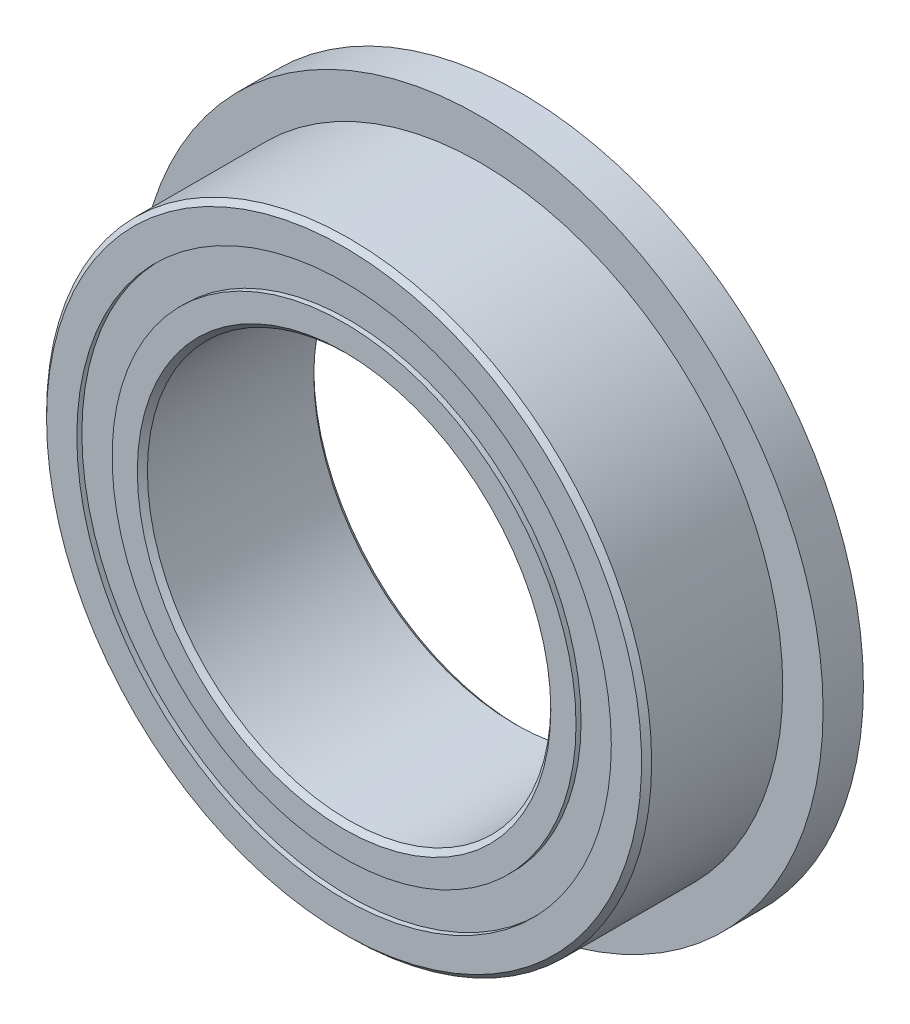
ISO-10303-21;
HEADER;
FILE_DESCRIPTION(('STEP AP214'),'2;1');
FILE_NAME('part.step','',(''),(''),'','','');
FILE_SCHEMA(('AUTOMOTIVE_DESIGN { 1 0 10303 214 1 1 1 1 }'));
ENDSEC;
DATA;
#1=APPLICATION_CONTEXT('core data for automotive mechanical design processes');
#2=APPLICATION_PROTOCOL_DEFINITION('international standard','automotive_design',2000,#1);
#3=PRODUCT_CONTEXT('',#1,'mechanical');
#4=PRODUCT('Part','Part','',(#3));
#5=PRODUCT_RELATED_PRODUCT_CATEGORY('part','',(#4));
#6=PRODUCT_DEFINITION_FORMATION('','',#4);
#7=PRODUCT_DEFINITION_CONTEXT('part definition',#1,'design');
#8=PRODUCT_DEFINITION('design','',#6,#7);
#9=PRODUCT_DEFINITION_SHAPE('','',#8);
#10=(LENGTH_UNIT() NAMED_UNIT(*) SI_UNIT(.MILLI.,.METRE.));
#11=(NAMED_UNIT(*) PLANE_ANGLE_UNIT() SI_UNIT($,.RADIAN.));
#12=(NAMED_UNIT(*) SI_UNIT($,.STERADIAN.) SOLID_ANGLE_UNIT());
#13=UNCERTAINTY_MEASURE_WITH_UNIT(LENGTH_MEASURE(1.E-05),#10,'distance_accuracy_value','');
#14=(GEOMETRIC_REPRESENTATION_CONTEXT(3) GLOBAL_UNCERTAINTY_ASSIGNED_CONTEXT((#13)) GLOBAL_UNIT_ASSIGNED_CONTEXT((#10,
#11,#12)) REPRESENTATION_CONTEXT('',''));
#15=CARTESIAN_POINT('',(0.,0.,0.));
#16=DIRECTION('',(0.,0.,1.));
#17=DIRECTION('',(1.,0.,0.));
#18=AXIS2_PLACEMENT_3D('',#15,#16,#17);
#19=CARTESIAN_POINT('',(0.,6.,1.75));
#20=DIRECTION('',(0.,0.,-1.));
#21=DIRECTION('',(-1.,0.,0.));
#22=AXIS2_PLACEMENT_3D('',#19,#20,#21);
#23=PLANE('',#22);
#24=CARTESIAN_POINT('',(0.,0.,1.75));
#25=DIRECTION('',(0.,0.,1.));
#26=DIRECTION('',(1.,0.,0.));
#27=AXIS2_PLACEMENT_3D('',#24,#25,#26);
#28=CIRCLE('',#27,4.6);
#29=CARTESIAN_POINT('',(4.6,0.,1.75));
#30=VERTEX_POINT('',#29);
#31=EDGE_CURVE('E18',#30,#30,#28,.F.);
#32=ORIENTED_EDGE('',*,*,#31,.F.);
#33=EDGE_LOOP('',(#32));
#34=FACE_BOUND('',#33,.T.);
#35=CARTESIAN_POINT('',(0.,0.,1.74999999995862));
#36=DIRECTION('',(0.,0.,1.));
#37=DIRECTION('',(0.,-1.,0.));
#38=AXIS2_PLACEMENT_3D('',#35,#36,#37);
#39=CIRCLE('',#38,4.099999999994);
#40=CARTESIAN_POINT('',(0.,-4.099999999994,1.74999999995862));
#41=VERTEX_POINT('',#40);
#42=EDGE_CURVE('E63',#41,#41,#39,.F.);
#43=ORIENTED_EDGE('',*,*,#42,.T.);
#44=EDGE_LOOP('',(#43));
#45=FACE_BOUND('',#44,.T.);
#46=ADVANCED_FACE('F15',(#34,#45),#23,.F.);
#47=CARTESIAN_POINT('',(0.,0.,1.65));
#48=DIRECTION('',(0.,0.,1.));
#49=DIRECTION('',(1.,0.,0.));
#50=AXIS2_PLACEMENT_3D('',#47,#48,#49);
#51=CYLINDRICAL_SURFACE('',#50,4.6);
#52=CARTESIAN_POINT('',(0.,0.,1.65));
#53=DIRECTION('',(0.,0.,1.));
#54=DIRECTION('',(1.,0.,0.));
#55=AXIS2_PLACEMENT_3D('',#52,#53,#54);
#56=CIRCLE('',#55,4.6);
#57=CARTESIAN_POINT('',(4.6,0.,1.65));
#58=VERTEX_POINT('',#57);
#59=EDGE_CURVE('E61',#58,#58,#56,.F.);
#60=ORIENTED_EDGE('',*,*,#59,.F.);
#61=EDGE_LOOP('',(#60));
#62=FACE_BOUND('',#61,.T.);
#63=ORIENTED_EDGE('',*,*,#31,.T.);
#64=EDGE_LOOP('',(#63));
#65=FACE_BOUND('',#64,.T.);
#66=ADVANCED_FACE('F70',(#62,#65),#51,.T.);
#67=CARTESIAN_POINT('',(0.,0.,1.74999999990177));
#68=DIRECTION('',(0.,0.,1.));
#69=DIRECTION('',(0.,-1.,0.));
#70=AXIS2_PLACEMENT_3D('',#67,#68,#69);
#71=CONICAL_SURFACE('',#70,4.09999999993715,0.785398163397448);
#72=ORIENTED_EDGE('',*,*,#42,.F.);
#73=EDGE_LOOP('',(#72));
#74=FACE_BOUND('',#73,.T.);
#75=CARTESIAN_POINT('',(0.,0.,1.65));
#76=DIRECTION('',(0.,0.,1.));
#77=DIRECTION('',(1.,0.,0.));
#78=AXIS2_PLACEMENT_3D('',#75,#76,#77);
#79=CIRCLE('',#78,4.);
#80=CARTESIAN_POINT('',(4.,0.,1.65));
#81=VERTEX_POINT('',#80);
#82=EDGE_CURVE('E30',#81,#81,#79,.F.);
#83=ORIENTED_EDGE('',*,*,#82,.T.);
#84=EDGE_LOOP('',(#83));
#85=FACE_BOUND('',#84,.T.);
#86=ADVANCED_FACE('F76',(#74,#85),#71,.F.);
#87=CARTESIAN_POINT('',(0.,0.,1.65));
#88=DIRECTION('',(0.,0.,1.));
#89=DIRECTION('',(1.,0.,0.));
#90=AXIS2_PLACEMENT_3D('',#87,#88,#89);
#91=PLANE('',#90);
#92=CARTESIAN_POINT('',(0.,0.,1.65));
#93=DIRECTION('',(0.,0.,1.));
#94=DIRECTION('',(1.,0.,0.));
#95=AXIS2_PLACEMENT_3D('',#92,#93,#94);
#96=CIRCLE('',#95,5.3);
#97=CARTESIAN_POINT('',(5.3,0.,1.65));
#98=VERTEX_POINT('',#97);
#99=EDGE_CURVE('E58',#98,#98,#96,.T.);
#100=ORIENTED_EDGE('',*,*,#99,.T.);
#101=EDGE_LOOP('',(#100));
#102=FACE_BOUND('',#101,.T.);
#103=ORIENTED_EDGE('',*,*,#59,.T.);
#104=EDGE_LOOP('',(#103));
#105=FACE_BOUND('',#104,.T.);
#106=ADVANCED_FACE('F133',(#102,#105),#91,.T.);
#107=CARTESIAN_POINT('',(0.,0.,1.75));
#108=DIRECTION('',(0.,0.,1.));
#109=DIRECTION('',(1.,0.,0.));
#110=AXIS2_PLACEMENT_3D('',#107,#108,#109);
#111=CYLINDRICAL_SURFACE('',#110,4.);
#112=ORIENTED_EDGE('',*,*,#82,.F.);
#113=EDGE_LOOP('',(#112));
#114=FACE_BOUND('',#113,.T.);
#115=CARTESIAN_POINT('',(0.,0.,-1.64999999998372));
#116=DIRECTION('',(0.,0.,-1.));
#117=DIRECTION('',(-1.,0.,0.));
#118=AXIS2_PLACEMENT_3D('',#115,#116,#117);
#119=CIRCLE('',#118,3.99999999996226);
#120=CARTESIAN_POINT('',(-3.99999999996226,0.,-1.64999999998372));
#121=VERTEX_POINT('',#120);
#122=EDGE_CURVE('E57',#121,#121,#119,.T.);
#123=ORIENTED_EDGE('',*,*,#122,.T.);
#124=EDGE_LOOP('',(#123));
#125=FACE_BOUND('',#124,.T.);
#126=ADVANCED_FACE('F129',(#114,#125),#111,.F.);
#127=CARTESIAN_POINT('',(0.,0.,1.65));
#128=DIRECTION('',(0.,0.,1.));
#129=DIRECTION('',(1.,0.,0.));
#130=AXIS2_PLACEMENT_3D('',#127,#128,#129);
#131=CYLINDRICAL_SURFACE('',#130,5.3);
#132=ORIENTED_EDGE('',*,*,#99,.F.);
#133=EDGE_LOOP('',(#132));
#134=FACE_BOUND('',#133,.T.);
#135=CARTESIAN_POINT('',(0.,0.,1.75));
#136=DIRECTION('',(0.,0.,1.));
#137=DIRECTION('',(1.,0.,0.));
#138=AXIS2_PLACEMENT_3D('',#135,#136,#137);
#139=CIRCLE('',#138,5.3);
#140=CARTESIAN_POINT('',(5.3,0.,1.75));
#141=VERTEX_POINT('',#140);
#142=EDGE_CURVE('E54',#141,#141,#139,.T.);
#143=ORIENTED_EDGE('',*,*,#142,.T.);
#144=EDGE_LOOP('',(#143));
#145=FACE_BOUND('',#144,.T.);
#146=ADVANCED_FACE('F125',(#134,#145),#131,.F.);
#147=CARTESIAN_POINT('',(0.,0.,-1.74999999995862));
#148=DIRECTION('',(0.,0.,-1.));
#149=DIRECTION('',(-1.,0.,0.));
#150=AXIS2_PLACEMENT_3D('',#147,#148,#149);
#151=CONICAL_SURFACE('',#150,4.09999999993715,0.785398163397448);
#152=CARTESIAN_POINT('',(0.,0.,-1.75000000001546));
#153=DIRECTION('',(0.,0.,-1.));
#154=DIRECTION('',(-1.,0.,0.));
#155=AXIS2_PLACEMENT_3D('',#152,#153,#154);
#156=CIRCLE('',#155,4.099999999994);
#157=CARTESIAN_POINT('',(-4.099999999994,0.,-1.75000000001546));
#158=VERTEX_POINT('',#157);
#159=EDGE_CURVE('E51',#158,#158,#156,.T.);
#160=ORIENTED_EDGE('',*,*,#159,.T.);
#161=EDGE_LOOP('',(#160));
#162=FACE_BOUND('',#161,.T.);
#163=ORIENTED_EDGE('',*,*,#122,.F.);
#164=EDGE_LOOP('',(#163));
#165=FACE_BOUND('',#164,.T.);
#166=ADVANCED_FACE('F121',(#162,#165),#151,.F.);
#167=CARTESIAN_POINT('',(0.,6.,1.75));
#168=DIRECTION('',(0.,0.,-1.));
#169=DIRECTION('',(-1.,0.,0.));
#170=AXIS2_PLACEMENT_3D('',#167,#168,#169);
#171=PLANE('',#170);
#172=ORIENTED_EDGE('',*,*,#142,.F.);
#173=EDGE_LOOP('',(#172));
#174=FACE_BOUND('',#173,.T.);
#175=CARTESIAN_POINT('',(0.,0.,1.74999999995862));
#176=DIRECTION('',(0.,0.,-1.));
#177=DIRECTION('',(-1.,0.,0.));
#178=AXIS2_PLACEMENT_3D('',#175,#176,#177);
#179=CIRCLE('',#178,5.89999999999691);
#180=CARTESIAN_POINT('',(-5.89999999999691,0.,1.74999999995862));
#181=VERTEX_POINT('',#180);
#182=EDGE_CURVE('E48',#181,#181,#179,.T.);
#183=ORIENTED_EDGE('',*,*,#182,.F.);
#184=EDGE_LOOP('',(#183));
#185=FACE_BOUND('',#184,.T.);
#186=ADVANCED_FACE('F117',(#174,#185),#171,.F.);
#187=CARTESIAN_POINT('',(0.,4.,-1.75));
#188=DIRECTION('',(0.,0.,1.));
#189=DIRECTION('',(1.,0.,0.));
#190=AXIS2_PLACEMENT_3D('',#187,#188,#189);
#191=PLANE('',#190);
#192=CARTESIAN_POINT('',(0.,0.,-1.75));
#193=DIRECTION('',(0.,0.,-1.));
#194=DIRECTION('',(-1.,0.,0.));
#195=AXIS2_PLACEMENT_3D('',#192,#193,#194);
#196=CIRCLE('',#195,4.6);
#197=CARTESIAN_POINT('',(-4.6,0.,-1.75));
#198=VERTEX_POINT('',#197);
#199=EDGE_CURVE('E45',#198,#198,#196,.F.);
#200=ORIENTED_EDGE('',*,*,#199,.F.);
#201=EDGE_LOOP('',(#200));
#202=FACE_BOUND('',#201,.T.);
#203=ORIENTED_EDGE('',*,*,#159,.F.);
#204=EDGE_LOOP('',(#203));
#205=FACE_BOUND('',#204,.T.);
#206=ADVANCED_FACE('F113',(#202,#205),#191,.F.);
#207=CARTESIAN_POINT('',(0.,0.,1.65000000009741));
#208=DIRECTION('',(0.,0.,-1.));
#209=DIRECTION('',(-1.,0.,0.));
#210=AXIS2_PLACEMENT_3D('',#207,#208,#209);
#211=CONICAL_SURFACE('',#210,5.99999999985812,0.785398163397448);
#212=CARTESIAN_POINT('',(0.,0.,1.65));
#213=DIRECTION('',(0.,0.,1.));
#214=DIRECTION('',(1.,0.,0.));
#215=AXIS2_PLACEMENT_3D('',#212,#213,#214);
#216=CIRCLE('',#215,6.);
#217=CARTESIAN_POINT('',(6.,0.,1.65));
#218=VERTEX_POINT('',#217);
#219=EDGE_CURVE('E44',#218,#218,#216,.F.);
#220=ORIENTED_EDGE('',*,*,#219,.F.);
#221=EDGE_LOOP('',(#220));
#222=FACE_BOUND('',#221,.T.);
#223=ORIENTED_EDGE('',*,*,#182,.T.);
#224=EDGE_LOOP('',(#223));
#225=FACE_BOUND('',#224,.T.);
#226=ADVANCED_FACE('F109',(#222,#225),#211,.T.);
#227=CARTESIAN_POINT('',(0.,0.,-1.65));
#228=DIRECTION('',(0.,0.,-1.));
#229=DIRECTION('',(-1.,0.,0.));
#230=AXIS2_PLACEMENT_3D('',#227,#228,#229);
#231=CYLINDRICAL_SURFACE('',#230,4.6);
#232=ORIENTED_EDGE('',*,*,#199,.T.);
#233=EDGE_LOOP('',(#232));
#234=FACE_BOUND('',#233,.T.);
#235=CARTESIAN_POINT('',(0.,0.,-1.65));
#236=DIRECTION('',(0.,0.,-1.));
#237=DIRECTION('',(-1.,0.,0.));
#238=AXIS2_PLACEMENT_3D('',#235,#236,#237);
#239=CIRCLE('',#238,4.6);
#240=CARTESIAN_POINT('',(-4.6,0.,-1.65));
#241=VERTEX_POINT('',#240);
#242=EDGE_CURVE('E41',#241,#241,#239,.F.);
#243=ORIENTED_EDGE('',*,*,#242,.F.);
#244=EDGE_LOOP('',(#243));
#245=FACE_BOUND('',#244,.T.);
#246=ADVANCED_FACE('F105',(#234,#245),#231,.T.);
#247=CARTESIAN_POINT('',(0.,0.,1.75));
#248=DIRECTION('',(0.,0.,1.));
#249=DIRECTION('',(1.,0.,0.));
#250=AXIS2_PLACEMENT_3D('',#247,#248,#249);
#251=CYLINDRICAL_SURFACE('',#250,6.);
#252=ORIENTED_EDGE('',*,*,#219,.T.);
#253=EDGE_LOOP('',(#252));
#254=FACE_BOUND('',#253,.T.);
#255=CARTESIAN_POINT('',(0.,0.,-0.95));
#256=DIRECTION('',(0.,0.,1.));
#257=DIRECTION('',(1.,0.,0.));
#258=AXIS2_PLACEMENT_3D('',#255,#256,#257);
#259=CIRCLE('',#258,6.);
#260=CARTESIAN_POINT('',(6.,0.,-0.95));
#261=VERTEX_POINT('',#260);
#262=EDGE_CURVE('E38',#261,#261,#259,.T.);
#263=ORIENTED_EDGE('',*,*,#262,.T.);
#264=EDGE_LOOP('',(#263));
#265=FACE_BOUND('',#264,.T.);
#266=ADVANCED_FACE('F101',(#254,#265),#251,.T.);
#267=CARTESIAN_POINT('',(0.,0.,-1.65));
#268=DIRECTION('',(0.,0.,-1.));
#269=DIRECTION('',(-1.,0.,0.));
#270=AXIS2_PLACEMENT_3D('',#267,#268,#269);
#271=PLANE('',#270);
#272=ORIENTED_EDGE('',*,*,#242,.T.);
#273=EDGE_LOOP('',(#272));
#274=FACE_BOUND('',#273,.T.);
#275=CARTESIAN_POINT('',(0.,0.,-1.65));
#276=DIRECTION('',(0.,0.,-1.));
#277=DIRECTION('',(-1.,0.,0.));
#278=AXIS2_PLACEMENT_3D('',#275,#276,#277);
#279=CIRCLE('',#278,5.3);
#280=CARTESIAN_POINT('',(-5.3,0.,-1.65));
#281=VERTEX_POINT('',#280);
#282=EDGE_CURVE('E35',#281,#281,#279,.T.);
#283=ORIENTED_EDGE('',*,*,#282,.T.);
#284=EDGE_LOOP('',(#283));
#285=FACE_BOUND('',#284,.T.);
#286=ADVANCED_FACE('F97',(#274,#285),#271,.T.);
#287=CARTESIAN_POINT('',(0.,6.8,-0.95));
#288=DIRECTION('',(0.,0.,-1.));
#289=DIRECTION('',(-1.,0.,0.));
#290=AXIS2_PLACEMENT_3D('',#287,#288,#289);
#291=PLANE('',#290);
#292=CARTESIAN_POINT('',(0.,0.,-0.95));
#293=DIRECTION('',(0.,0.,1.));
#294=DIRECTION('',(1.,0.,0.));
#295=AXIS2_PLACEMENT_3D('',#292,#293,#294);
#296=CIRCLE('',#295,6.8);
#297=CARTESIAN_POINT('',(6.8,0.,-0.95));
#298=VERTEX_POINT('',#297);
#299=EDGE_CURVE('E27',#298,#298,#296,.F.);
#300=ORIENTED_EDGE('',*,*,#299,.F.);
#301=EDGE_LOOP('',(#300));
#302=FACE_BOUND('',#301,.T.);
#303=ORIENTED_EDGE('',*,*,#262,.F.);
#304=EDGE_LOOP('',(#303));
#305=FACE_BOUND('',#304,.T.);
#306=ADVANCED_FACE('F93',(#302,#305),#291,.F.);
#307=CARTESIAN_POINT('',(0.,0.,-1.65));
#308=DIRECTION('',(0.,0.,-1.));
#309=DIRECTION('',(-1.,0.,0.));
#310=AXIS2_PLACEMENT_3D('',#307,#308,#309);
#311=CYLINDRICAL_SURFACE('',#310,5.3);
#312=CARTESIAN_POINT('',(0.,0.,-1.75));
#313=DIRECTION('',(0.,0.,-1.));
#314=DIRECTION('',(-1.,0.,0.));
#315=AXIS2_PLACEMENT_3D('',#312,#313,#314);
#316=CIRCLE('',#315,5.3);
#317=CARTESIAN_POINT('',(-5.3,0.,-1.75));
#318=VERTEX_POINT('',#317);
#319=EDGE_CURVE('E22',#318,#318,#316,.T.);
#320=ORIENTED_EDGE('',*,*,#319,.T.);
#321=EDGE_LOOP('',(#320));
#322=FACE_BOUND('',#321,.T.);
#323=ORIENTED_EDGE('',*,*,#282,.F.);
#324=EDGE_LOOP('',(#323));
#325=FACE_BOUND('',#324,.T.);
#326=ADVANCED_FACE('F86',(#322,#325),#311,.F.);
#327=CARTESIAN_POINT('',(0.,0.,1.75));
#328=DIRECTION('',(0.,0.,1.));
#329=DIRECTION('',(1.,0.,0.));
#330=AXIS2_PLACEMENT_3D('',#327,#328,#329);
#331=CYLINDRICAL_SURFACE('',#330,6.8);
#332=ORIENTED_EDGE('',*,*,#299,.T.);
#333=EDGE_LOOP('',(#332));
#334=FACE_BOUND('',#333,.T.);
#335=CARTESIAN_POINT('',(0.,0.,-1.75));
#336=DIRECTION('',(0.,0.,1.));
#337=DIRECTION('',(1.,0.,0.));
#338=AXIS2_PLACEMENT_3D('',#335,#336,#337);
#339=CIRCLE('',#338,6.8);
#340=CARTESIAN_POINT('',(6.8,0.,-1.75));
#341=VERTEX_POINT('',#340);
#342=EDGE_CURVE('E9',#341,#341,#339,.T.);
#343=ORIENTED_EDGE('',*,*,#342,.T.);
#344=EDGE_LOOP('',(#343));
#345=FACE_BOUND('',#344,.T.);
#346=ADVANCED_FACE('F80',(#334,#345),#331,.T.);
#347=CARTESIAN_POINT('',(0.,4.,-1.75));
#348=DIRECTION('',(0.,0.,1.));
#349=DIRECTION('',(1.,0.,0.));
#350=AXIS2_PLACEMENT_3D('',#347,#348,#349);
#351=PLANE('',#350);
#352=ORIENTED_EDGE('',*,*,#342,.F.);
#353=EDGE_LOOP('',(#352));
#354=FACE_BOUND('',#353,.T.);
#355=ORIENTED_EDGE('',*,*,#319,.F.);
#356=EDGE_LOOP('',(#355));
#357=FACE_BOUND('',#356,.T.);
#358=ADVANCED_FACE('F78',(#354,#357),#351,.F.);
#359=CLOSED_SHELL('',(#46,#66,#86,#106,#126,#146,#166,#186,#206,#226,#246,#266,#286,#306,#326,
#346,#358));
#360=MANIFOLD_SOLID_BREP('B1',#359);
#361=ADVANCED_BREP_SHAPE_REPRESENTATION('',(#18,#360),#14);
#362=SHAPE_DEFINITION_REPRESENTATION(#9,#361);
ENDSEC;
END-ISO-10303-21;
